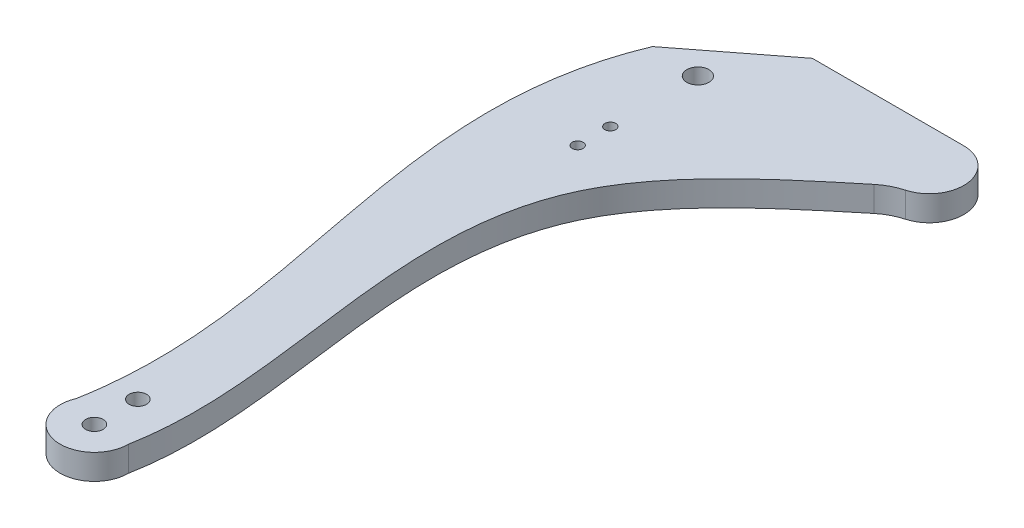
ISO-10303-21;
HEADER;
FILE_DESCRIPTION(('STEP AP214'),'2;1');
FILE_NAME('part.step','',(''),(''),'','','');
FILE_SCHEMA(('AUTOMOTIVE_DESIGN { 1 0 10303 214 1 1 1 1 }'));
ENDSEC;
DATA;
#1=APPLICATION_CONTEXT('core data for automotive mechanical design processes');
#2=APPLICATION_PROTOCOL_DEFINITION('international standard','automotive_design',2000,#1);
#3=PRODUCT_CONTEXT('',#1,'mechanical');
#4=PRODUCT('Part','Part','',(#3));
#5=PRODUCT_RELATED_PRODUCT_CATEGORY('part','',(#4));
#6=PRODUCT_DEFINITION_FORMATION('','',#4);
#7=PRODUCT_DEFINITION_CONTEXT('part definition',#1,'design');
#8=PRODUCT_DEFINITION('design','',#6,#7);
#9=PRODUCT_DEFINITION_SHAPE('','',#8);
#10=(LENGTH_UNIT() NAMED_UNIT(*) SI_UNIT(.MILLI.,.METRE.));
#11=(NAMED_UNIT(*) PLANE_ANGLE_UNIT() SI_UNIT($,.RADIAN.));
#12=(NAMED_UNIT(*) SI_UNIT($,.STERADIAN.) SOLID_ANGLE_UNIT());
#13=UNCERTAINTY_MEASURE_WITH_UNIT(LENGTH_MEASURE(1.E-05),#10,'distance_accuracy_value','');
#14=(GEOMETRIC_REPRESENTATION_CONTEXT(3) GLOBAL_UNCERTAINTY_ASSIGNED_CONTEXT((#13)) GLOBAL_UNIT_ASSIGNED_CONTEXT((#10,
#11,#12)) REPRESENTATION_CONTEXT('',''));
#15=CARTESIAN_POINT('',(0.,0.,0.));
#16=DIRECTION('',(0.,0.,1.));
#17=DIRECTION('',(1.,0.,0.));
#18=AXIS2_PLACEMENT_3D('',#15,#16,#17);
#19=CARTESIAN_POINT('',(-33.5800678442369,4.5,56.28156678213));
#20=DIRECTION('',(0.,-1.,0.));
#21=DIRECTION('',(0.,0.,-1.));
#22=AXIS2_PLACEMENT_3D('',#19,#20,#21);
#23=PLANE('',#22);
#24=CARTESIAN_POINT('',(-23.6205551146785,4.5,25.9189959022686));
#25=DIRECTION('',(0.,1.,0.));
#26=DIRECTION('',(0.,0.,1.));
#27=AXIS2_PLACEMENT_3D('',#24,#25,#26);
#28=CIRCLE('',#27,0.969999999999998);
#29=CARTESIAN_POINT('',(-23.6205551146785,4.5,26.8889959022686));
#30=VERTEX_POINT('',#29);
#31=EDGE_CURVE('E205',#30,#30,#28,.T.);
#32=ORIENTED_EDGE('',*,*,#31,.F.);
#33=EDGE_LOOP('',(#32));
#34=FACE_BOUND('',#33,.T.);
#35=CARTESIAN_POINT('',(-23.6205551146785,4.5,112.138995974269));
#36=DIRECTION('',(0.,1.,0.));
#37=DIRECTION('',(0.,0.,1.));
#38=AXIS2_PLACEMENT_3D('',#35,#36,#37);
#39=CIRCLE('',#38,1.554999938);
#40=CARTESIAN_POINT('',(-23.6205551146785,4.5,113.693995912269));
#41=VERTEX_POINT('',#40);
#42=EDGE_CURVE('E193',#41,#41,#39,.T.);
#43=ORIENTED_EDGE('',*,*,#42,.F.);
#44=EDGE_LOOP('',(#43));
#45=FACE_BOUND('',#44,.T.);
#46=DIRECTION('',(-0.79076812279447,0.,0.612115819083374));
#47=VECTOR('',#46,1.);
#48=CARTESIAN_POINT('',(-16.1448996631949,4.5,-8.4540032736779));
#49=LINE('',#48,#47);
#50=CARTESIAN_POINT('',(-16.1448996631949,4.5,-8.4540032736779));
#51=VERTEX_POINT('',#50);
#52=CARTESIAN_POINT('',(-32.217521916136,4.5,3.98745213098542));
#53=VERTEX_POINT('',#52);
#54=EDGE_CURVE('E146',#51,#53,#49,.T.);
#55=ORIENTED_EDGE('',*,*,#54,.T.);
#56=CARTESIAN_POINT('',(-32.217521916136,4.5,3.98745213098542));
#57=CARTESIAN_POINT('',(-42.2065149060718,4.5,27.8278205053542));
#58=CARTESIAN_POINT('',(-29.5613701153101,4.5,63.9822503451925));
#59=CARTESIAN_POINT('',(-27.3901690543069,4.5,99.6650419871978));
#60=CARTESIAN_POINT('',(-29.2394941851879,4.5,109.757437382177));
#61=B_SPLINE_CURVE_WITH_KNOTS('',3,(#56,#57,#58,#59,#60),.UNSPECIFIED.,.F.,.F.,(4,1,4),(0.,
0.696305278791168,0.977824200877543),.UNSPECIFIED.);
#62=CARTESIAN_POINT('',(-29.2394941851879,4.5,109.757437382177));
#63=VERTEX_POINT('',#62);
#64=EDGE_CURVE('E89',#53,#63,#61,.T.);
#65=ORIENTED_EDGE('',*,*,#64,.T.);
#66=CARTESIAN_POINT('',(-23.6205551146785,4.5,112.138995974269));
#67=DIRECTION('',(0.,1.,0.));
#68=DIRECTION('',(0.,0.,1.));
#69=AXIS2_PLACEMENT_3D('',#66,#67,#68);
#70=CIRCLE('',#69,6.10281063164049);
#71=CARTESIAN_POINT('',(-17.517744483038,4.5,112.138995974269));
#72=VERTEX_POINT('',#71);
#73=EDGE_CURVE('E158',#63,#72,#70,.T.);
#74=ORIENTED_EDGE('',*,*,#73,.T.);
#75=CARTESIAN_POINT('',(-17.517744483038,4.5,112.138995974269));
#76=CARTESIAN_POINT('',(-12.8946829626533,4.5,87.3265466424668));
#77=CARTESIAN_POINT('',(-31.4890867813224,4.5,46.9437900593646));
#78=CARTESIAN_POINT('',(-4.6960452827572,4.5,16.5858685499804));
#79=CARTESIAN_POINT('',(4.93253274399876,4.5,8.71883291305758));
#80=CARTESIAN_POINT('',(8.82409988389271,4.5,5.51846179454827));
#81=B_SPLINE_CURVE_WITH_KNOTS('',3,(#75,#76,#77,#78,#79,#80),.UNSPECIFIED.,.F.,.F.,(4,1,1,4),
(0.0234781084162324,0.692645434763002,0.868534101728694,1.),.UNSPECIFIED.);
#82=CARTESIAN_POINT('',(8.82409988389271,4.5,5.51846179454826));
#83=VERTEX_POINT('',#82);
#84=EDGE_CURVE('E105',#72,#83,#81,.T.);
#85=ORIENTED_EDGE('',*,*,#84,.T.);
#86=CARTESIAN_POINT('',(15.1759095054056,4.5,13.2420953003573));
#87=DIRECTION('',(0.,-1.,0.));
#88=DIRECTION('',(0.,0.,1.));
#89=AXIS2_PLACEMENT_3D('',#86,#87,#88);
#90=CIRCLE('',#89,10.);
#91=CARTESIAN_POINT('',(12.5127720902824,4.5,3.60323130566523));
#92=VERTEX_POINT('',#91);
#93=EDGE_CURVE('E99',#83,#92,#90,.T.);
#94=ORIENTED_EDGE('',*,*,#93,.T.);
#95=CARTESIAN_POINT('',(10.8777451080779,4.5,-2.31452668144633));
#96=DIRECTION('',(0.,1.,0.));
#97=DIRECTION('',(0.,0.,1.));
#98=AXIS2_PLACEMENT_3D('',#95,#96,#97);
#99=CIRCLE('',#98,6.13947659223157);
#100=CARTESIAN_POINT('',(10.8777451080779,4.5,-8.4540032736779));
#101=VERTEX_POINT('',#100);
#102=EDGE_CURVE('E103',#92,#101,#99,.T.);
#103=ORIENTED_EDGE('',*,*,#102,.T.);
#104=DIRECTION('',(-1.,0.,0.));
#105=VECTOR('',#104,1.);
#106=CARTESIAN_POINT('',(-16.1448996631949,4.5,-8.4540032736779));
#107=LINE('',#106,#105);
#108=EDGE_CURVE('E49',#101,#51,#107,.T.);
#109=ORIENTED_EDGE('',*,*,#108,.T.);
#110=EDGE_LOOP('',(#55,#65,#74,#85,#94,#103,#109));
#111=FACE_BOUND('',#110,.T.);
#112=CARTESIAN_POINT('',(-23.6205551146785,4.5,4.47899590226864));
#113=DIRECTION('',(0.,1.,0.));
#114=DIRECTION('',(0.,0.,1.));
#115=AXIS2_PLACEMENT_3D('',#112,#113,#114);
#116=CIRCLE('',#115,1.97500000000001);
#117=CARTESIAN_POINT('',(-23.6205551146785,4.5,6.45399590226865));
#118=VERTEX_POINT('',#117);
#119=EDGE_CURVE('E127',#118,#118,#116,.T.);
#120=ORIENTED_EDGE('',*,*,#119,.F.);
#121=EDGE_LOOP('',(#120));
#122=FACE_BOUND('',#121,.T.);
#123=CARTESIAN_POINT('',(-23.6205551146785,4.5,104.378996000269));
#124=DIRECTION('',(0.,1.,0.));
#125=DIRECTION('',(0.,0.,1.));
#126=AXIS2_PLACEMENT_3D('',#123,#124,#125);
#127=CIRCLE('',#126,1.554999938);
#128=CARTESIAN_POINT('',(-23.6205551146785,4.5,105.933995938269));
#129=VERTEX_POINT('',#128);
#130=EDGE_CURVE('E199',#129,#129,#127,.T.);
#131=ORIENTED_EDGE('',*,*,#130,.F.);
#132=EDGE_LOOP('',(#131));
#133=FACE_BOUND('',#132,.T.);
#134=CARTESIAN_POINT('',(-23.6205551146785,4.5,20.0989959022686));
#135=DIRECTION('',(0.,1.,0.));
#136=DIRECTION('',(0.,0.,1.));
#137=AXIS2_PLACEMENT_3D('',#134,#135,#136);
#138=CIRCLE('',#137,0.969999999999998);
#139=CARTESIAN_POINT('',(-23.6205551146785,4.5,21.0689959022686));
#140=VERTEX_POINT('',#139);
#141=EDGE_CURVE('E211',#140,#140,#138,.T.);
#142=ORIENTED_EDGE('',*,*,#141,.F.);
#143=EDGE_LOOP('',(#142));
#144=FACE_BOUND('',#143,.T.);
#145=ADVANCED_FACE('F32',(#34,#45,#111,#122,#133,#144),#23,.F.);
#146=CARTESIAN_POINT('',(-33.5800678442369,0.,56.28156678213));
#147=DIRECTION('',(0.,-1.,0.));
#148=DIRECTION('',(0.,0.,-1.));
#149=AXIS2_PLACEMENT_3D('',#146,#147,#148);
#150=PLANE('',#149);
#151=CARTESIAN_POINT('',(-23.6205551146785,0.,25.9189959022686));
#152=DIRECTION('',(0.,1.,0.));
#153=DIRECTION('',(0.,0.,1.));
#154=AXIS2_PLACEMENT_3D('',#151,#152,#153);
#155=CIRCLE('',#154,0.969999999999998);
#156=CARTESIAN_POINT('',(-23.6205551146785,0.,26.8889959022686));
#157=VERTEX_POINT('',#156);
#158=EDGE_CURVE('E208',#157,#157,#155,.T.);
#159=ORIENTED_EDGE('',*,*,#158,.T.);
#160=EDGE_LOOP('',(#159));
#161=FACE_BOUND('',#160,.T.);
#162=CARTESIAN_POINT('',(-23.6205551146785,0.,112.138995974269));
#163=DIRECTION('',(0.,1.,0.));
#164=DIRECTION('',(0.,0.,1.));
#165=AXIS2_PLACEMENT_3D('',#162,#163,#164);
#166=CIRCLE('',#165,1.554999938);
#167=CARTESIAN_POINT('',(-23.6205551146785,0.,113.693995912269));
#168=VERTEX_POINT('',#167);
#169=EDGE_CURVE('E196',#168,#168,#166,.T.);
#170=ORIENTED_EDGE('',*,*,#169,.T.);
#171=EDGE_LOOP('',(#170));
#172=FACE_BOUND('',#171,.T.);
#173=DIRECTION('',(-0.79076812279447,0.,0.612115819083374));
#174=VECTOR('',#173,1.);
#175=CARTESIAN_POINT('',(-16.1448996631949,0.,-8.4540032736779));
#176=LINE('',#175,#174);
#177=CARTESIAN_POINT('',(-16.1448996631949,0.,-8.4540032736779));
#178=VERTEX_POINT('',#177);
#179=CARTESIAN_POINT('',(-32.217521916136,0.,3.98745213098542));
#180=VERTEX_POINT('',#179);
#181=EDGE_CURVE('E123',#178,#180,#176,.T.);
#182=ORIENTED_EDGE('',*,*,#181,.F.);
#183=DIRECTION('',(-1.,0.,0.));
#184=VECTOR('',#183,1.);
#185=CARTESIAN_POINT('',(-16.1448996631949,0.,-8.4540032736779));
#186=LINE('',#185,#184);
#187=CARTESIAN_POINT('',(10.8777451080779,0.,-8.4540032736779));
#188=VERTEX_POINT('',#187);
#189=EDGE_CURVE('E81',#188,#178,#186,.T.);
#190=ORIENTED_EDGE('',*,*,#189,.F.);
#191=CARTESIAN_POINT('',(10.8777451080779,0.,-2.31452668144633));
#192=DIRECTION('',(0.,1.,0.));
#193=DIRECTION('',(0.,0.,1.));
#194=AXIS2_PLACEMENT_3D('',#191,#192,#193);
#195=CIRCLE('',#194,6.13947659223157);
#196=CARTESIAN_POINT('',(12.5127720902824,0.,3.60323130566523));
#197=VERTEX_POINT('',#196);
#198=EDGE_CURVE('E75',#197,#188,#195,.T.);
#199=ORIENTED_EDGE('',*,*,#198,.F.);
#200=CARTESIAN_POINT('',(15.1759095054056,0.,13.2420953003573));
#201=DIRECTION('',(0.,-1.,0.));
#202=DIRECTION('',(0.,0.,1.));
#203=AXIS2_PLACEMENT_3D('',#200,#201,#202);
#204=CIRCLE('',#203,10.);
#205=CARTESIAN_POINT('',(8.82409988389271,0.,5.51846179454826));
#206=VERTEX_POINT('',#205);
#207=EDGE_CURVE('E113',#206,#197,#204,.T.);
#208=ORIENTED_EDGE('',*,*,#207,.F.);
#209=CARTESIAN_POINT('',(-17.517744483038,0.,112.138995974269));
#210=CARTESIAN_POINT('',(-12.8946829626533,0.,87.3265466424668));
#211=CARTESIAN_POINT('',(-31.4890867813224,0.,46.9437900593646));
#212=CARTESIAN_POINT('',(-4.6960452827572,0.,16.5858685499804));
#213=CARTESIAN_POINT('',(4.93253274399876,0.,8.71883291305758));
#214=CARTESIAN_POINT('',(8.82409988389271,0.,5.51846179454827));
#215=B_SPLINE_CURVE_WITH_KNOTS('',3,(#209,#210,#211,#212,#213,#214),.UNSPECIFIED.,.F.,.F.,(4,1,
1,4),(0.0234781084162324,0.692645434763002,0.868534101728694,1.),.UNSPECIFIED.);
#216=CARTESIAN_POINT('',(-17.517744483038,0.,112.138995974269));
#217=VERTEX_POINT('',#216);
#218=EDGE_CURVE('E136',#217,#206,#215,.T.);
#219=ORIENTED_EDGE('',*,*,#218,.F.);
#220=CARTESIAN_POINT('',(-23.6205551146785,0.,112.138995974269));
#221=DIRECTION('',(0.,1.,0.));
#222=DIRECTION('',(0.,0.,1.));
#223=AXIS2_PLACEMENT_3D('',#220,#221,#222);
#224=CIRCLE('',#223,6.10281063164049);
#225=CARTESIAN_POINT('',(-29.2394941851879,0.,109.757437382177));
#226=VERTEX_POINT('',#225);
#227=EDGE_CURVE('E131',#226,#217,#224,.T.);
#228=ORIENTED_EDGE('',*,*,#227,.F.);
#229=CARTESIAN_POINT('',(-32.217521916136,0.,3.98745213098542));
#230=CARTESIAN_POINT('',(-42.2065149060718,0.,27.8278205053542));
#231=CARTESIAN_POINT('',(-29.5613701153101,0.,63.9822503451925));
#232=CARTESIAN_POINT('',(-27.3901690543069,0.,99.6650419871978));
#233=CARTESIAN_POINT('',(-29.2394941851879,0.,109.757437382177));
#234=B_SPLINE_CURVE_WITH_KNOTS('',3,(#229,#230,#231,#232,#233),.UNSPECIFIED.,.F.,.F.,(4,1,4),
(0.,0.696305278791168,0.977824200877543),.UNSPECIFIED.);
#235=EDGE_CURVE('E126',#180,#226,#234,.T.);
#236=ORIENTED_EDGE('',*,*,#235,.F.);
#237=EDGE_LOOP('',(#182,#190,#199,#208,#219,#228,#236));
#238=FACE_BOUND('',#237,.T.);
#239=CARTESIAN_POINT('',(-23.6205551146785,0.,4.47899590226864));
#240=DIRECTION('',(0.,1.,0.));
#241=DIRECTION('',(0.,0.,1.));
#242=AXIS2_PLACEMENT_3D('',#239,#240,#241);
#243=CIRCLE('',#242,1.97500000000001);
#244=CARTESIAN_POINT('',(-23.6205551146785,0.,6.45399590226865));
#245=VERTEX_POINT('',#244);
#246=EDGE_CURVE('E190',#245,#245,#243,.T.);
#247=ORIENTED_EDGE('',*,*,#246,.T.);
#248=EDGE_LOOP('',(#247));
#249=FACE_BOUND('',#248,.T.);
#250=CARTESIAN_POINT('',(-23.6205551146785,0.,104.378996000269));
#251=DIRECTION('',(0.,1.,0.));
#252=DIRECTION('',(0.,0.,1.));
#253=AXIS2_PLACEMENT_3D('',#250,#251,#252);
#254=CIRCLE('',#253,1.554999938);
#255=CARTESIAN_POINT('',(-23.6205551146785,0.,105.933995938269));
#256=VERTEX_POINT('',#255);
#257=EDGE_CURVE('E202',#256,#256,#254,.T.);
#258=ORIENTED_EDGE('',*,*,#257,.T.);
#259=EDGE_LOOP('',(#258));
#260=FACE_BOUND('',#259,.T.);
#261=CARTESIAN_POINT('',(-23.6205551146785,0.,20.0989959022686));
#262=DIRECTION('',(0.,1.,0.));
#263=DIRECTION('',(0.,0.,1.));
#264=AXIS2_PLACEMENT_3D('',#261,#262,#263);
#265=CIRCLE('',#264,0.969999999999998);
#266=CARTESIAN_POINT('',(-23.6205551146785,0.,21.0689959022686));
#267=VERTEX_POINT('',#266);
#268=EDGE_CURVE('E214',#267,#267,#265,.T.);
#269=ORIENTED_EDGE('',*,*,#268,.T.);
#270=EDGE_LOOP('',(#269));
#271=FACE_BOUND('',#270,.T.);
#272=ADVANCED_FACE('F162',(#161,#172,#238,#249,#260,#271),#150,.T.);
#273=CARTESIAN_POINT('',(-16.1448996631949,4.5,-8.4540032736779));
#274=DIRECTION('',(0.612115819083374,0.,0.79076812279447));
#275=DIRECTION('',(0.79076812279447,0.,-0.612115819083374));
#276=AXIS2_PLACEMENT_3D('',#273,#274,#275);
#277=PLANE('',#276);
#278=ORIENTED_EDGE('',*,*,#181,.T.);
#279=DIRECTION('',(0.,-1.,0.));
#280=VECTOR('',#279,1.);
#281=CARTESIAN_POINT('',(-32.217521916136,4.5,3.98745213098542));
#282=LINE('',#281,#280);
#283=EDGE_CURVE('E11',#53,#180,#282,.T.);
#284=ORIENTED_EDGE('',*,*,#283,.F.);
#285=ORIENTED_EDGE('',*,*,#54,.F.);
#286=DIRECTION('',(0.,-1.,0.));
#287=VECTOR('',#286,1.);
#288=CARTESIAN_POINT('',(-16.1448996631949,4.5,-8.4540032736779));
#289=LINE('',#288,#287);
#290=EDGE_CURVE('E119',#51,#178,#289,.T.);
#291=ORIENTED_EDGE('',*,*,#290,.T.);
#292=EDGE_LOOP('',(#278,#284,#285,#291));
#293=FACE_BOUND('',#292,.T.);
#294=ADVANCED_FACE('F34',(#293),#277,.F.);
#295=DIRECTION('',(0.,-1.,0.));
#296=VECTOR('',#295,1.);
#297=SURFACE_OF_LINEAR_EXTRUSION('',#61,#296);
#298=ORIENTED_EDGE('',*,*,#235,.T.);
#299=DIRECTION('',(0.,-1.,0.));
#300=VECTOR('',#299,1.);
#301=CARTESIAN_POINT('',(-29.2394941851879,4.5,109.757437382177));
#302=LINE('',#301,#300);
#303=EDGE_CURVE('E41',#63,#226,#302,.T.);
#304=ORIENTED_EDGE('',*,*,#303,.F.);
#305=ORIENTED_EDGE('',*,*,#64,.F.);
#306=ORIENTED_EDGE('',*,*,#283,.T.);
#307=EDGE_LOOP('',(#298,#304,#305,#306));
#308=FACE_BOUND('',#307,.T.);
#309=ADVANCED_FACE('F180',(#308),#297,.F.);
#310=CARTESIAN_POINT('',(-23.6205551146785,4.5,112.138995974269));
#311=DIRECTION('',(0.,-1.,0.));
#312=DIRECTION('',(0.,0.,-1.));
#313=AXIS2_PLACEMENT_3D('',#310,#311,#312);
#314=CYLINDRICAL_SURFACE('',#313,6.10281063164049);
#315=ORIENTED_EDGE('',*,*,#227,.T.);
#316=DIRECTION('',(0.,-1.,0.));
#317=VECTOR('',#316,1.);
#318=CARTESIAN_POINT('',(-17.517744483038,4.5,112.138995974269));
#319=LINE('',#318,#317);
#320=EDGE_CURVE('E150',#72,#217,#319,.T.);
#321=ORIENTED_EDGE('',*,*,#320,.F.);
#322=ORIENTED_EDGE('',*,*,#73,.F.);
#323=ORIENTED_EDGE('',*,*,#303,.T.);
#324=EDGE_LOOP('',(#315,#321,#322,#323));
#325=FACE_BOUND('',#324,.T.);
#326=ADVANCED_FACE('F156',(#325),#314,.T.);
#327=DIRECTION('',(0.,-1.,0.));
#328=VECTOR('',#327,1.);
#329=SURFACE_OF_LINEAR_EXTRUSION('',#81,#328);
#330=ORIENTED_EDGE('',*,*,#218,.T.);
#331=DIRECTION('',(0.,-1.,0.));
#332=VECTOR('',#331,1.);
#333=CARTESIAN_POINT('',(8.82409988389271,4.5,5.51846179454826));
#334=LINE('',#333,#332);
#335=EDGE_CURVE('E114',#83,#206,#334,.T.);
#336=ORIENTED_EDGE('',*,*,#335,.F.);
#337=ORIENTED_EDGE('',*,*,#84,.F.);
#338=ORIENTED_EDGE('',*,*,#320,.T.);
#339=EDGE_LOOP('',(#330,#336,#337,#338));
#340=FACE_BOUND('',#339,.T.);
#341=ADVANCED_FACE('F165',(#340),#329,.F.);
#342=CARTESIAN_POINT('',(15.1759095054056,4.5,13.2420953003573));
#343=DIRECTION('',(0.,-1.,0.));
#344=DIRECTION('',(0.,0.,-1.));
#345=AXIS2_PLACEMENT_3D('',#342,#343,#344);
#346=CYLINDRICAL_SURFACE('',#345,10.);
#347=ORIENTED_EDGE('',*,*,#207,.T.);
#348=DIRECTION('',(0.,-1.,0.));
#349=VECTOR('',#348,1.);
#350=CARTESIAN_POINT('',(12.5127720902824,4.5,3.60323130566523));
#351=LINE('',#350,#349);
#352=EDGE_CURVE('E110',#92,#197,#351,.T.);
#353=ORIENTED_EDGE('',*,*,#352,.F.);
#354=ORIENTED_EDGE('',*,*,#93,.F.);
#355=ORIENTED_EDGE('',*,*,#335,.T.);
#356=EDGE_LOOP('',(#347,#353,#354,#355));
#357=FACE_BOUND('',#356,.T.);
#358=ADVANCED_FACE('F111',(#357),#346,.F.);
#359=CARTESIAN_POINT('',(10.8777451080779,4.5,-2.31452668144633));
#360=DIRECTION('',(0.,-1.,0.));
#361=DIRECTION('',(0.,0.,-1.));
#362=AXIS2_PLACEMENT_3D('',#359,#360,#361);
#363=CYLINDRICAL_SURFACE('',#362,6.13947659223157);
#364=ORIENTED_EDGE('',*,*,#198,.T.);
#365=DIRECTION('',(0.,-1.,0.));
#366=VECTOR('',#365,1.);
#367=CARTESIAN_POINT('',(10.8777451080779,4.5,-8.4540032736779));
#368=LINE('',#367,#366);
#369=EDGE_CURVE('E115',#101,#188,#368,.T.);
#370=ORIENTED_EDGE('',*,*,#369,.F.);
#371=ORIENTED_EDGE('',*,*,#102,.F.);
#372=ORIENTED_EDGE('',*,*,#352,.T.);
#373=EDGE_LOOP('',(#364,#370,#371,#372));
#374=FACE_BOUND('',#373,.T.);
#375=ADVANCED_FACE('F117',(#374),#363,.T.);
#376=CARTESIAN_POINT('',(-16.1448996631949,4.5,-8.4540032736779));
#377=DIRECTION('',(0.,0.,1.));
#378=DIRECTION('',(1.,0.,0.));
#379=AXIS2_PLACEMENT_3D('',#376,#377,#378);
#380=PLANE('',#379);
#381=ORIENTED_EDGE('',*,*,#189,.T.);
#382=ORIENTED_EDGE('',*,*,#290,.F.);
#383=ORIENTED_EDGE('',*,*,#108,.F.);
#384=ORIENTED_EDGE('',*,*,#369,.T.);
#385=EDGE_LOOP('',(#381,#382,#383,#384));
#386=FACE_BOUND('',#385,.T.);
#387=ADVANCED_FACE('F237',(#386),#380,.F.);
#388=CARTESIAN_POINT('',(-23.6205551146785,4.5,4.47899590226864));
#389=DIRECTION('',(0.,-1.,0.));
#390=DIRECTION('',(0.,0.,-1.));
#391=AXIS2_PLACEMENT_3D('',#388,#389,#390);
#392=CYLINDRICAL_SURFACE('',#391,1.97500000000001);
#393=ORIENTED_EDGE('',*,*,#119,.T.);
#394=EDGE_LOOP('',(#393));
#395=FACE_BOUND('',#394,.T.);
#396=ORIENTED_EDGE('',*,*,#246,.F.);
#397=EDGE_LOOP('',(#396));
#398=FACE_BOUND('',#397,.T.);
#399=ADVANCED_FACE('F234',(#395,#398),#392,.F.);
#400=CARTESIAN_POINT('',(-23.6205551146785,4.5,112.138995974269));
#401=DIRECTION('',(0.,-1.,0.));
#402=DIRECTION('',(0.,0.,-1.));
#403=AXIS2_PLACEMENT_3D('',#400,#401,#402);
#404=CYLINDRICAL_SURFACE('',#403,1.554999938);
#405=ORIENTED_EDGE('',*,*,#42,.T.);
#406=EDGE_LOOP('',(#405));
#407=FACE_BOUND('',#406,.T.);
#408=ORIENTED_EDGE('',*,*,#169,.F.);
#409=EDGE_LOOP('',(#408));
#410=FACE_BOUND('',#409,.T.);
#411=ADVANCED_FACE('F300',(#407,#410),#404,.F.);
#412=CARTESIAN_POINT('',(-23.6205551146785,4.5,104.378996000269));
#413=DIRECTION('',(0.,-1.,0.));
#414=DIRECTION('',(0.,0.,-1.));
#415=AXIS2_PLACEMENT_3D('',#412,#413,#414);
#416=CYLINDRICAL_SURFACE('',#415,1.554999938);
#417=ORIENTED_EDGE('',*,*,#130,.T.);
#418=EDGE_LOOP('',(#417));
#419=FACE_BOUND('',#418,.T.);
#420=ORIENTED_EDGE('',*,*,#257,.F.);
#421=EDGE_LOOP('',(#420));
#422=FACE_BOUND('',#421,.T.);
#423=ADVANCED_FACE('F308',(#419,#422),#416,.F.);
#424=CARTESIAN_POINT('',(-23.6205551146785,4.5,25.9189959022686));
#425=DIRECTION('',(0.,-1.,0.));
#426=DIRECTION('',(0.,0.,-1.));
#427=AXIS2_PLACEMENT_3D('',#424,#425,#426);
#428=CYLINDRICAL_SURFACE('',#427,0.969999999999998);
#429=ORIENTED_EDGE('',*,*,#31,.T.);
#430=EDGE_LOOP('',(#429));
#431=FACE_BOUND('',#430,.T.);
#432=ORIENTED_EDGE('',*,*,#158,.F.);
#433=EDGE_LOOP('',(#432));
#434=FACE_BOUND('',#433,.T.);
#435=ADVANCED_FACE('F316',(#431,#434),#428,.F.);
#436=CARTESIAN_POINT('',(-23.6205551146785,4.5,20.0989959022686));
#437=DIRECTION('',(0.,-1.,0.));
#438=DIRECTION('',(0.,0.,-1.));
#439=AXIS2_PLACEMENT_3D('',#436,#437,#438);
#440=CYLINDRICAL_SURFACE('',#439,0.969999999999998);
#441=ORIENTED_EDGE('',*,*,#141,.T.);
#442=EDGE_LOOP('',(#441));
#443=FACE_BOUND('',#442,.T.);
#444=ORIENTED_EDGE('',*,*,#268,.F.);
#445=EDGE_LOOP('',(#444));
#446=FACE_BOUND('',#445,.T.);
#447=ADVANCED_FACE('F220',(#443,#446),#440,.F.);
#448=CLOSED_SHELL('',(#145,#272,#294,#309,#326,#341,#358,#375,#387,#399,#411,#423,#435,#447));
#449=MANIFOLD_SOLID_BREP('B2',#448);
#450=ADVANCED_BREP_SHAPE_REPRESENTATION('',(#18,#449),#14);
#451=SHAPE_DEFINITION_REPRESENTATION(#9,#450);
ENDSEC;
END-ISO-10303-21;
